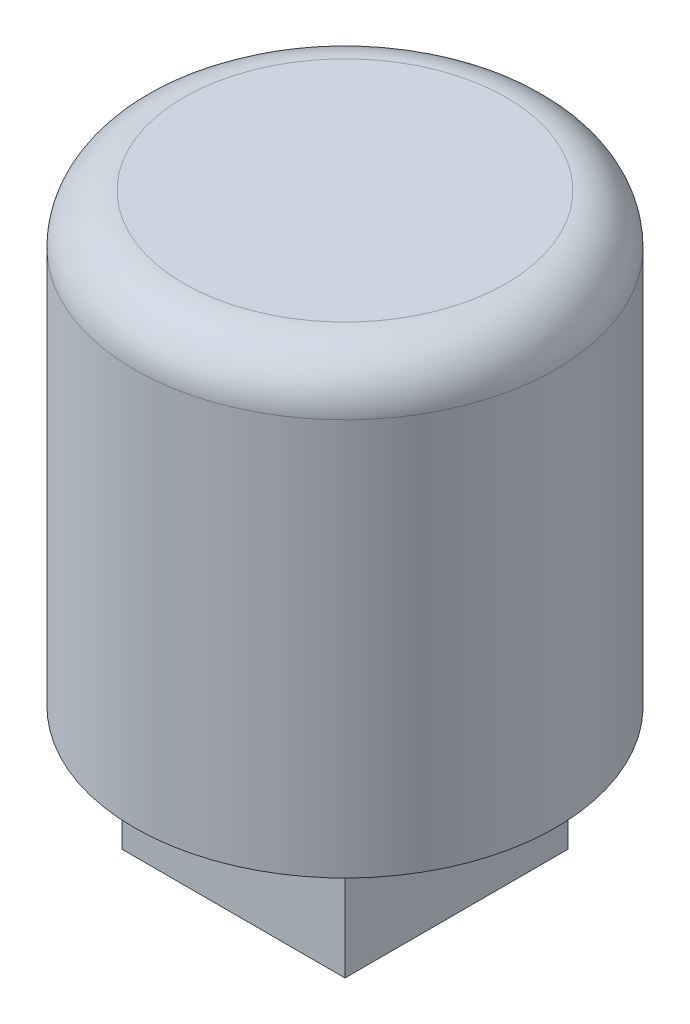
ISO-10303-21;
HEADER;
FILE_DESCRIPTION(('STEP AP214'),'2;1');
FILE_NAME('part.step','',(''),(''),'','','');
FILE_SCHEMA(('AUTOMOTIVE_DESIGN { 1 0 10303 214 1 1 1 1 }'));
ENDSEC;
DATA;
#1=APPLICATION_CONTEXT('core data for automotive mechanical design processes');
#2=APPLICATION_PROTOCOL_DEFINITION('international standard','automotive_design',2000,#1);
#3=PRODUCT_CONTEXT('',#1,'mechanical');
#4=PRODUCT('Part','Part','',(#3));
#5=PRODUCT_RELATED_PRODUCT_CATEGORY('part','',(#4));
#6=PRODUCT_DEFINITION_FORMATION('','',#4);
#7=PRODUCT_DEFINITION_CONTEXT('part definition',#1,'design');
#8=PRODUCT_DEFINITION('design','',#6,#7);
#9=PRODUCT_DEFINITION_SHAPE('','',#8);
#10=(LENGTH_UNIT() NAMED_UNIT(*) SI_UNIT(.MILLI.,.METRE.));
#11=(NAMED_UNIT(*) PLANE_ANGLE_UNIT() SI_UNIT($,.RADIAN.));
#12=(NAMED_UNIT(*) SI_UNIT($,.STERADIAN.) SOLID_ANGLE_UNIT());
#13=UNCERTAINTY_MEASURE_WITH_UNIT(LENGTH_MEASURE(1.E-05),#10,'distance_accuracy_value','');
#14=(GEOMETRIC_REPRESENTATION_CONTEXT(3) GLOBAL_UNCERTAINTY_ASSIGNED_CONTEXT((#13)) GLOBAL_UNIT_ASSIGNED_CONTEXT((#10,
#11,#12)) REPRESENTATION_CONTEXT('',''));
#15=CARTESIAN_POINT('',(0.,0.,0.));
#16=DIRECTION('',(0.,0.,1.));
#17=DIRECTION('',(1.,0.,0.));
#18=AXIS2_PLACEMENT_3D('',#15,#16,#17);
#19=CARTESIAN_POINT('',(0.,0.,0.));
#20=DIRECTION('',(0.,1.,0.));
#21=DIRECTION('',(0.,0.,1.));
#22=AXIS2_PLACEMENT_3D('',#19,#20,#21);
#23=PLANE('',#22);
#24=CARTESIAN_POINT('',(0.,0.,0.));
#25=DIRECTION('',(0.,1.,0.));
#26=DIRECTION('',(0.,0.,1.));
#27=AXIS2_PLACEMENT_3D('',#24,#25,#26);
#28=CIRCLE('',#27,85.);
#29=CARTESIAN_POINT('',(0.,0.,-85.));
#30=VERTEX_POINT('',#29);
#31=EDGE_CURVE('E94',#30,#30,#28,.T.);
#32=ORIENTED_EDGE('',*,*,#31,.F.);
#33=EDGE_LOOP('',(#32));
#34=FACE_BOUND('',#33,.T.);
#35=DIRECTION('',(0.,0.,-1.));
#36=VECTOR('',#35,1.);
#37=CARTESIAN_POINT('',(-45.,0.,45.));
#38=LINE('',#37,#36);
#39=CARTESIAN_POINT('',(-45.,0.,45.));
#40=VERTEX_POINT('',#39);
#41=CARTESIAN_POINT('',(-45.,0.,-45.));
#42=VERTEX_POINT('',#41);
#43=EDGE_CURVE('E48',#40,#42,#38,.T.);
#44=ORIENTED_EDGE('',*,*,#43,.F.);
#45=DIRECTION('',(-1.,0.,0.));
#46=VECTOR('',#45,1.);
#47=CARTESIAN_POINT('',(45.,0.,45.));
#48=LINE('',#47,#46);
#49=CARTESIAN_POINT('',(45.,0.,45.));
#50=VERTEX_POINT('',#49);
#51=EDGE_CURVE('E52',#50,#40,#48,.T.);
#52=ORIENTED_EDGE('',*,*,#51,.F.);
#53=DIRECTION('',(0.,0.,1.));
#54=VECTOR('',#53,1.);
#55=CARTESIAN_POINT('',(45.,0.,45.));
#56=LINE('',#55,#54);
#57=CARTESIAN_POINT('',(45.,0.,-45.));
#58=VERTEX_POINT('',#57);
#59=EDGE_CURVE('E141',#58,#50,#56,.T.);
#60=ORIENTED_EDGE('',*,*,#59,.F.);
#61=DIRECTION('',(1.,0.,0.));
#62=VECTOR('',#61,1.);
#63=CARTESIAN_POINT('',(45.,0.,-45.));
#64=LINE('',#63,#62);
#65=EDGE_CURVE('E147',#42,#58,#64,.T.);
#66=ORIENTED_EDGE('',*,*,#65,.F.);
#67=EDGE_LOOP('',(#44,#52,#60,#66));
#68=FACE_BOUND('',#67,.T.);
#69=ADVANCED_FACE('F33',(#34,#68),#23,.F.);
#70=CARTESIAN_POINT('',(0.,180.,0.));
#71=DIRECTION('',(0.,-1.,0.));
#72=DIRECTION('',(0.,0.,-1.));
#73=AXIS2_PLACEMENT_3D('',#70,#71,#72);
#74=CYLINDRICAL_SURFACE('',#73,85.);
#75=CARTESIAN_POINT('',(0.,160.,0.));
#76=DIRECTION('',(0.,1.,0.));
#77=DIRECTION('',(0.,0.,1.));
#78=AXIS2_PLACEMENT_3D('',#75,#76,#77);
#79=CIRCLE('',#78,85.);
#80=CARTESIAN_POINT('',(0.,160.,-85.));
#81=VERTEX_POINT('',#80);
#82=EDGE_CURVE('E11',#81,#81,#79,.F.);
#83=CARTESIAN_POINT('',(0.,160.,-85.));
#84=CARTESIAN_POINT('',(0.,158.333333333333,-85.));
#85=CARTESIAN_POINT('',(0.,156.666666666667,-85.));
#86=CARTESIAN_POINT('',(0.,153.333333333333,-85.));
#87=CARTESIAN_POINT('',(0.,151.666666666667,-85.));
#88=CARTESIAN_POINT('',(0.,148.333333333333,-85.));
#89=CARTESIAN_POINT('',(0.,146.666666666667,-85.));
#90=CARTESIAN_POINT('',(0.,143.333333333333,-85.));
#91=CARTESIAN_POINT('',(0.,141.666666666667,-85.));
#92=CARTESIAN_POINT('',(0.,138.333333333333,-85.));
#93=CARTESIAN_POINT('',(0.,136.666666666667,-85.));
#94=CARTESIAN_POINT('',(0.,133.333333333333,-85.));
#95=CARTESIAN_POINT('',(0.,131.666666666667,-85.));
#96=CARTESIAN_POINT('',(0.,128.333333333333,-85.));
#97=CARTESIAN_POINT('',(0.,126.666666666667,-85.));
#98=CARTESIAN_POINT('',(0.,123.333333333333,-85.));
#99=CARTESIAN_POINT('',(0.,121.666666666667,-85.));
#100=CARTESIAN_POINT('',(0.,118.333333333333,-85.));
#101=CARTESIAN_POINT('',(0.,116.666666666667,-85.));
#102=CARTESIAN_POINT('',(0.,113.333333333333,-85.));
#103=CARTESIAN_POINT('',(0.,111.666666666667,-85.));
#104=CARTESIAN_POINT('',(0.,108.333333333333,-85.));
#105=CARTESIAN_POINT('',(0.,106.666666666667,-85.));
#106=CARTESIAN_POINT('',(0.,103.333333333333,-85.));
#107=CARTESIAN_POINT('',(0.,101.666666666667,-85.));
#108=CARTESIAN_POINT('',(0.,98.3333333333333,-85.));
#109=CARTESIAN_POINT('',(0.,96.6666666666667,-85.));
#110=CARTESIAN_POINT('',(0.,93.3333333333333,-85.));
#111=CARTESIAN_POINT('',(0.,91.6666666666667,-85.));
#112=CARTESIAN_POINT('',(0.,88.3333333333333,-85.));
#113=CARTESIAN_POINT('',(0.,86.6666666666667,-85.));
#114=CARTESIAN_POINT('',(0.,83.3333333333333,-85.));
#115=CARTESIAN_POINT('',(0.,81.6666666666667,-85.));
#116=CARTESIAN_POINT('',(0.,78.3333333333333,-85.));
#117=CARTESIAN_POINT('',(0.,76.6666666666666,-85.));
#118=CARTESIAN_POINT('',(0.,73.3333333333333,-85.));
#119=CARTESIAN_POINT('',(0.,71.6666666666666,-85.));
#120=CARTESIAN_POINT('',(0.,68.3333333333333,-85.));
#121=CARTESIAN_POINT('',(0.,66.6666666666667,-85.));
#122=CARTESIAN_POINT('',(0.,63.3333333333333,-85.));
#123=CARTESIAN_POINT('',(0.,61.6666666666667,-85.));
#124=CARTESIAN_POINT('',(0.,58.3333333333333,-85.));
#125=CARTESIAN_POINT('',(0.,56.6666666666667,-85.));
#126=CARTESIAN_POINT('',(0.,53.3333333333333,-85.));
#127=CARTESIAN_POINT('',(0.,51.6666666666667,-85.));
#128=CARTESIAN_POINT('',(0.,48.3333333333333,-85.));
#129=CARTESIAN_POINT('',(0.,46.6666666666667,-85.));
#130=CARTESIAN_POINT('',(0.,43.3333333333333,-85.));
#131=CARTESIAN_POINT('',(0.,41.6666666666667,-85.));
#132=CARTESIAN_POINT('',(0.,38.3333333333333,-85.));
#133=CARTESIAN_POINT('',(0.,36.6666666666667,-85.));
#134=CARTESIAN_POINT('',(0.,33.3333333333333,-85.));
#135=CARTESIAN_POINT('',(0.,31.6666666666667,-85.));
#136=CARTESIAN_POINT('',(0.,28.3333333333333,-85.));
#137=CARTESIAN_POINT('',(0.,26.6666666666667,-85.));
#138=CARTESIAN_POINT('',(0.,23.3333333333333,-85.));
#139=CARTESIAN_POINT('',(0.,21.6666666666667,-85.));
#140=CARTESIAN_POINT('',(0.,18.3333333333333,-85.));
#141=CARTESIAN_POINT('',(0.,16.6666666666667,-85.));
#142=CARTESIAN_POINT('',(0.,13.3333333333333,-85.));
#143=CARTESIAN_POINT('',(0.,11.6666666666667,-85.));
#144=CARTESIAN_POINT('',(0.,8.33333333333331,-85.));
#145=CARTESIAN_POINT('',(0.,6.66666666666664,-85.));
#146=CARTESIAN_POINT('',(0.,3.33333333333331,-85.));
#147=CARTESIAN_POINT('',(0.,1.66666666666664,-85.));
#148=CARTESIAN_POINT('',(0.,0.,-85.));
#149=B_SPLINE_CURVE_WITH_KNOTS('',3,(#83,#84,#85,#86,#87,#88,#89,#90,#91,#92,#93,#94,#95,#96,
#97,#98,#99,#100,#101,#102,#103,#104,#105,#106,#107,#108,#109,#110,#111,#112,#113,#114,#115,
#116,#117,#118,#119,#120,#121,#122,#123,#124,#125,#126,#127,#128,#129,#130,#131,#132,#133,#134,
#135,#136,#137,#138,#139,#140,#141,#142,#143,#144,#145,#146,#147,#148),.UNSPECIFIED.,.F.,.F.,(4,
2,2,2,2,2,2,2,2,2,2,2,2,2,2,2,2,2,2,2,2,2,2,2,2,2,2,2,2,2,2,2,4),(0.,5.,10.,15.,20.,25.,30.,35.,
40.,45.,50.,55.,60.,65.,70.,75.,80.,85.,90.,95.,100.,105.,110.,115.,120.,125.,130.,135.,140.,
145.,150.,155.,160.),.UNSPECIFIED.);
#150=EDGE_CURVE('BSEAM115',#81,#30,#149,.T.);
#151=ORIENTED_EDGE('',*,*,#82,.T.);
#152=ORIENTED_EDGE('',*,*,#31,.T.);
#153=ORIENTED_EDGE('',*,*,#150,.T.);
#154=ORIENTED_EDGE('',*,*,#150,.F.);
#155=EDGE_LOOP('',(#151,#153,#152,#154));
#156=FACE_BOUND('',#155,.T.);
#157=ADVANCED_FACE('F115',(#156),#74,.T.);
#158=CARTESIAN_POINT('',(0.,180.,0.));
#159=DIRECTION('',(0.,1.,0.));
#160=DIRECTION('',(0.,0.,1.));
#161=AXIS2_PLACEMENT_3D('',#158,#159,#160);
#162=PLANE('',#161);
#163=CARTESIAN_POINT('',(0.,180.,0.));
#164=DIRECTION('',(0.,1.,0.));
#165=DIRECTION('',(0.,0.,1.));
#166=AXIS2_PLACEMENT_3D('',#163,#164,#165);
#167=CIRCLE('',#166,65.);
#168=CARTESIAN_POINT('',(0.,180.,65.));
#169=VERTEX_POINT('',#168);
#170=EDGE_CURVE('E41',#169,#169,#167,.T.);
#171=ORIENTED_EDGE('',*,*,#170,.T.);
#172=EDGE_LOOP('',(#171));
#173=FACE_BOUND('',#172,.T.);
#174=ADVANCED_FACE('F104',(#173),#162,.T.);
#175=CARTESIAN_POINT('',(-45.,-50.,45.));
#176=DIRECTION('',(1.,0.,0.));
#177=DIRECTION('',(0.,0.,-1.));
#178=AXIS2_PLACEMENT_3D('',#175,#176,#177);
#179=PLANE('',#178);
#180=ORIENTED_EDGE('',*,*,#43,.T.);
#181=DIRECTION('',(0.,1.,0.));
#182=VECTOR('',#181,1.);
#183=CARTESIAN_POINT('',(-45.,-50.,-45.));
#184=LINE('',#183,#182);
#185=CARTESIAN_POINT('',(-45.,-50.,-45.));
#186=VERTEX_POINT('',#185);
#187=EDGE_CURVE('E77',#186,#42,#184,.T.);
#188=ORIENTED_EDGE('',*,*,#187,.F.);
#189=DIRECTION('',(0.,0.,-1.));
#190=VECTOR('',#189,1.);
#191=CARTESIAN_POINT('',(-45.,-50.,45.));
#192=LINE('',#191,#190);
#193=CARTESIAN_POINT('',(-45.,-50.,45.));
#194=VERTEX_POINT('',#193);
#195=EDGE_CURVE('E83',#194,#186,#192,.T.);
#196=ORIENTED_EDGE('',*,*,#195,.F.);
#197=DIRECTION('',(0.,1.,0.));
#198=VECTOR('',#197,1.);
#199=CARTESIAN_POINT('',(-45.,-50.,45.));
#200=LINE('',#199,#198);
#201=EDGE_CURVE('E139',#194,#40,#200,.T.);
#202=ORIENTED_EDGE('',*,*,#201,.T.);
#203=EDGE_LOOP('',(#180,#188,#196,#202));
#204=FACE_BOUND('',#203,.T.);
#205=ADVANCED_FACE('F93',(#204),#179,.F.);
#206=CARTESIAN_POINT('',(45.,-50.,-45.));
#207=DIRECTION('',(0.,0.,1.));
#208=DIRECTION('',(1.,0.,0.));
#209=AXIS2_PLACEMENT_3D('',#206,#207,#208);
#210=PLANE('',#209);
#211=ORIENTED_EDGE('',*,*,#65,.T.);
#212=DIRECTION('',(0.,1.,0.));
#213=VECTOR('',#212,1.);
#214=CARTESIAN_POINT('',(45.,-50.,-45.));
#215=LINE('',#214,#213);
#216=CARTESIAN_POINT('',(45.,-50.,-45.));
#217=VERTEX_POINT('',#216);
#218=EDGE_CURVE('E79',#217,#58,#215,.T.);
#219=ORIENTED_EDGE('',*,*,#218,.F.);
#220=DIRECTION('',(1.,0.,0.));
#221=VECTOR('',#220,1.);
#222=CARTESIAN_POINT('',(45.,-50.,-45.));
#223=LINE('',#222,#221);
#224=EDGE_CURVE('E72',#186,#217,#223,.T.);
#225=ORIENTED_EDGE('',*,*,#224,.F.);
#226=ORIENTED_EDGE('',*,*,#187,.T.);
#227=EDGE_LOOP('',(#211,#219,#225,#226));
#228=FACE_BOUND('',#227,.T.);
#229=ADVANCED_FACE('F75',(#228),#210,.F.);
#230=CARTESIAN_POINT('',(45.,-50.,45.));
#231=DIRECTION('',(-1.,0.,0.));
#232=DIRECTION('',(0.,0.,1.));
#233=AXIS2_PLACEMENT_3D('',#230,#231,#232);
#234=PLANE('',#233);
#235=ORIENTED_EDGE('',*,*,#59,.T.);
#236=DIRECTION('',(0.,1.,0.));
#237=VECTOR('',#236,1.);
#238=CARTESIAN_POINT('',(45.,-50.,45.));
#239=LINE('',#238,#237);
#240=CARTESIAN_POINT('',(45.,-50.,45.));
#241=VERTEX_POINT('',#240);
#242=EDGE_CURVE('E98',#241,#50,#239,.T.);
#243=ORIENTED_EDGE('',*,*,#242,.F.);
#244=DIRECTION('',(0.,0.,1.));
#245=VECTOR('',#244,1.);
#246=CARTESIAN_POINT('',(45.,-50.,45.));
#247=LINE('',#246,#245);
#248=EDGE_CURVE('E82',#217,#241,#247,.T.);
#249=ORIENTED_EDGE('',*,*,#248,.F.);
#250=ORIENTED_EDGE('',*,*,#218,.T.);
#251=EDGE_LOOP('',(#235,#243,#249,#250));
#252=FACE_BOUND('',#251,.T.);
#253=ADVANCED_FACE('F130',(#252),#234,.F.);
#254=CARTESIAN_POINT('',(45.,-50.,45.));
#255=DIRECTION('',(0.,0.,-1.));
#256=DIRECTION('',(-1.,0.,0.));
#257=AXIS2_PLACEMENT_3D('',#254,#255,#256);
#258=PLANE('',#257);
#259=ORIENTED_EDGE('',*,*,#51,.T.);
#260=ORIENTED_EDGE('',*,*,#201,.F.);
#261=DIRECTION('',(-1.,0.,0.));
#262=VECTOR('',#261,1.);
#263=CARTESIAN_POINT('',(45.,-50.,45.));
#264=LINE('',#263,#262);
#265=EDGE_CURVE('E88',#241,#194,#264,.T.);
#266=ORIENTED_EDGE('',*,*,#265,.F.);
#267=ORIENTED_EDGE('',*,*,#242,.T.);
#268=EDGE_LOOP('',(#259,#260,#266,#267));
#269=FACE_BOUND('',#268,.T.);
#270=ADVANCED_FACE('F111',(#269),#258,.F.);
#271=CARTESIAN_POINT('',(0.,-50.,0.));
#272=DIRECTION('',(0.,1.,0.));
#273=DIRECTION('',(0.,0.,1.));
#274=AXIS2_PLACEMENT_3D('',#271,#272,#273);
#275=PLANE('',#274);
#276=ORIENTED_EDGE('',*,*,#195,.T.);
#277=ORIENTED_EDGE('',*,*,#224,.T.);
#278=ORIENTED_EDGE('',*,*,#248,.T.);
#279=ORIENTED_EDGE('',*,*,#265,.T.);
#280=EDGE_LOOP('',(#276,#277,#278,#279));
#281=FACE_BOUND('',#280,.T.);
#282=ADVANCED_FACE('F86',(#281),#275,.F.);
#283=CARTESIAN_POINT('',(0.,160.,0.));
#284=DIRECTION('',(0.,1.,0.));
#285=DIRECTION('',(0.,0.,1.));
#286=AXIS2_PLACEMENT_3D('',#283,#284,#285);
#287=TOROIDAL_SURFACE('',#286,65.,20.);
#288=ORIENTED_EDGE('',*,*,#82,.F.);
#289=EDGE_LOOP('',(#288));
#290=FACE_BOUND('',#289,.T.);
#291=ORIENTED_EDGE('',*,*,#170,.F.);
#292=EDGE_LOOP('',(#291));
#293=FACE_BOUND('',#292,.T.);
#294=ADVANCED_FACE('F35',(#290,#293),#287,.T.);
#295=CLOSED_SHELL('',(#69,#157,#174,#205,#229,#253,#270,#282,#294));
#296=MANIFOLD_SOLID_BREP('B2',#295);
#297=ADVANCED_BREP_SHAPE_REPRESENTATION('',(#18,#296),#14);
#298=SHAPE_DEFINITION_REPRESENTATION(#9,#297);
ENDSEC;
END-ISO-10303-21;
